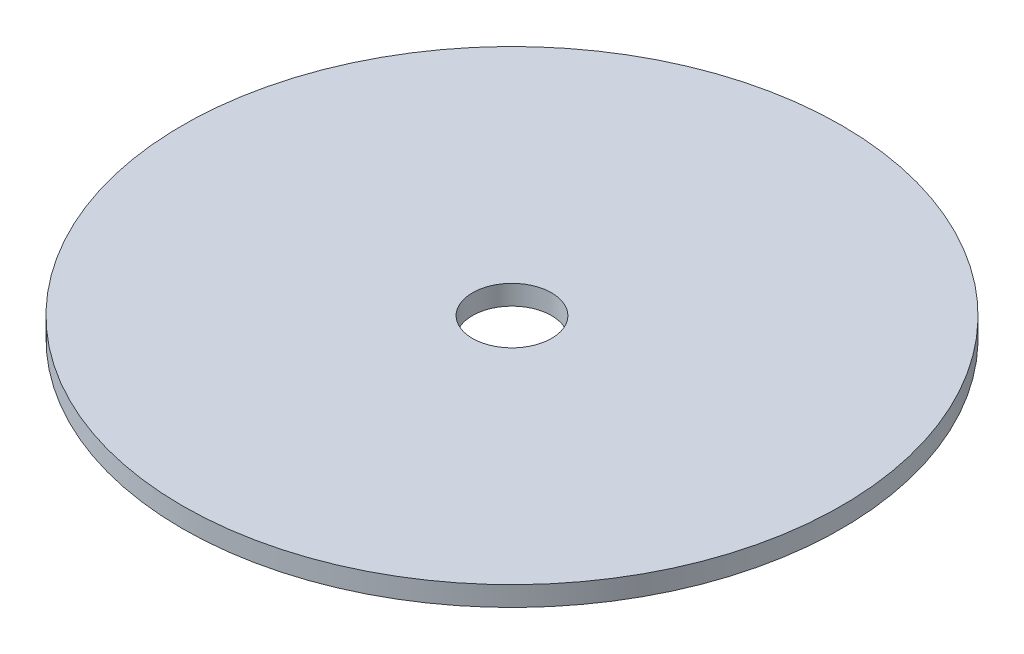
ISO-10303-21;
HEADER;
FILE_DESCRIPTION(('STEP AP214'),'2;1');
FILE_NAME('part.step','',(''),(''),'','','');
FILE_SCHEMA(('AUTOMOTIVE_DESIGN { 1 0 10303 214 1 1 1 1 }'));
ENDSEC;
DATA;
#1=APPLICATION_CONTEXT('core data for automotive mechanical design processes');
#2=APPLICATION_PROTOCOL_DEFINITION('international standard','automotive_design',2000,#1);
#3=PRODUCT_CONTEXT('',#1,'mechanical');
#4=PRODUCT('Part','Part','',(#3));
#5=PRODUCT_RELATED_PRODUCT_CATEGORY('part','',(#4));
#6=PRODUCT_DEFINITION_FORMATION('','',#4);
#7=PRODUCT_DEFINITION_CONTEXT('part definition',#1,'design');
#8=PRODUCT_DEFINITION('design','',#6,#7);
#9=PRODUCT_DEFINITION_SHAPE('','',#8);
#10=(LENGTH_UNIT() NAMED_UNIT(*) SI_UNIT(.MILLI.,.METRE.));
#11=(NAMED_UNIT(*) PLANE_ANGLE_UNIT() SI_UNIT($,.RADIAN.));
#12=(NAMED_UNIT(*) SI_UNIT($,.STERADIAN.) SOLID_ANGLE_UNIT());
#13=UNCERTAINTY_MEASURE_WITH_UNIT(LENGTH_MEASURE(1.E-05),#10,'distance_accuracy_value','');
#14=(GEOMETRIC_REPRESENTATION_CONTEXT(3) GLOBAL_UNCERTAINTY_ASSIGNED_CONTEXT((#13)) GLOBAL_UNIT_ASSIGNED_CONTEXT((#10,
#11,#12)) REPRESENTATION_CONTEXT('',''));
#15=CARTESIAN_POINT('',(0.,0.,0.));
#16=DIRECTION('',(0.,0.,1.));
#17=DIRECTION('',(1.,0.,0.));
#18=AXIS2_PLACEMENT_3D('',#15,#16,#17);
#19=CARTESIAN_POINT('',(0.,-1.5,0.));
#20=DIRECTION('',(0.,1.,0.));
#21=DIRECTION('',(0.,0.,1.));
#22=AXIS2_PLACEMENT_3D('',#19,#20,#21);
#23=CYLINDRICAL_SURFACE('',#22,25.);
#24=CARTESIAN_POINT('',(0.,-1.5,0.));
#25=DIRECTION('',(0.,1.,0.));
#26=DIRECTION('',(0.,0.,1.));
#27=AXIS2_PLACEMENT_3D('',#24,#25,#26);
#28=CIRCLE('',#27,25.);
#29=CARTESIAN_POINT('',(0.,-1.5,25.));
#30=VERTEX_POINT('',#29);
#31=EDGE_CURVE('E10',#30,#30,#28,.T.);
#32=ORIENTED_EDGE('',*,*,#31,.T.);
#33=EDGE_LOOP('',(#32));
#34=FACE_BOUND('',#33,.T.);
#35=CARTESIAN_POINT('',(0.,0.,0.));
#36=DIRECTION('',(0.,1.,0.));
#37=DIRECTION('',(0.,0.,1.));
#38=AXIS2_PLACEMENT_3D('',#35,#36,#37);
#39=CIRCLE('',#38,25.);
#40=CARTESIAN_POINT('',(0.,0.,25.));
#41=VERTEX_POINT('',#40);
#42=EDGE_CURVE('E45',#41,#41,#39,.T.);
#43=ORIENTED_EDGE('',*,*,#42,.F.);
#44=EDGE_LOOP('',(#43));
#45=FACE_BOUND('',#44,.T.);
#46=ADVANCED_FACE('F42',(#34,#45),#23,.T.);
#47=CARTESIAN_POINT('',(0.,-1.5,0.));
#48=DIRECTION('',(0.,1.,0.));
#49=DIRECTION('',(0.,0.,1.));
#50=AXIS2_PLACEMENT_3D('',#47,#48,#49);
#51=PLANE('',#50);
#52=CARTESIAN_POINT('',(0.,-1.5,0.));
#53=DIRECTION('',(0.,1.,0.));
#54=DIRECTION('',(0.,0.,1.));
#55=AXIS2_PLACEMENT_3D('',#52,#53,#54);
#56=CIRCLE('',#55,3.);
#57=CARTESIAN_POINT('',(0.,-1.5,3.));
#58=VERTEX_POINT('',#57);
#59=EDGE_CURVE('E52',#58,#58,#56,.T.);
#60=ORIENTED_EDGE('',*,*,#59,.T.);
#61=EDGE_LOOP('',(#60));
#62=FACE_BOUND('',#61,.T.);
#63=ORIENTED_EDGE('',*,*,#31,.F.);
#64=EDGE_LOOP('',(#63));
#65=FACE_BOUND('',#64,.T.);
#66=ADVANCED_FACE('F60',(#62,#65),#51,.F.);
#67=CARTESIAN_POINT('',(0.,0.,0.));
#68=DIRECTION('',(0.,1.,0.));
#69=DIRECTION('',(0.,0.,1.));
#70=AXIS2_PLACEMENT_3D('',#67,#68,#69);
#71=PLANE('',#70);
#72=CARTESIAN_POINT('',(0.,0.,0.));
#73=DIRECTION('',(0.,1.,0.));
#74=DIRECTION('',(0.,0.,1.));
#75=AXIS2_PLACEMENT_3D('',#72,#73,#74);
#76=CIRCLE('',#75,3.);
#77=CARTESIAN_POINT('',(0.,0.,3.));
#78=VERTEX_POINT('',#77);
#79=EDGE_CURVE('E54',#78,#78,#76,.T.);
#80=ORIENTED_EDGE('',*,*,#79,.F.);
#81=EDGE_LOOP('',(#80));
#82=FACE_BOUND('',#81,.T.);
#83=ORIENTED_EDGE('',*,*,#42,.T.);
#84=EDGE_LOOP('',(#83));
#85=FACE_BOUND('',#84,.T.);
#86=ADVANCED_FACE('F66',(#82,#85),#71,.T.);
#87=CARTESIAN_POINT('',(0.,-1.5,0.));
#88=DIRECTION('',(0.,1.,0.));
#89=DIRECTION('',(0.,0.,1.));
#90=AXIS2_PLACEMENT_3D('',#87,#88,#89);
#91=CYLINDRICAL_SURFACE('',#90,3.);
#92=ORIENTED_EDGE('',*,*,#59,.F.);
#93=EDGE_LOOP('',(#92));
#94=FACE_BOUND('',#93,.T.);
#95=ORIENTED_EDGE('',*,*,#79,.T.);
#96=EDGE_LOOP('',(#95));
#97=FACE_BOUND('',#96,.T.);
#98=ADVANCED_FACE('F63',(#94,#97),#91,.F.);
#99=CLOSED_SHELL('',(#46,#66,#86,#98));
#100=MANIFOLD_SOLID_BREP('B2',#99);
#101=ADVANCED_BREP_SHAPE_REPRESENTATION('',(#18,#100),#14);
#102=SHAPE_DEFINITION_REPRESENTATION(#9,#101);
ENDSEC;
END-ISO-10303-21;
